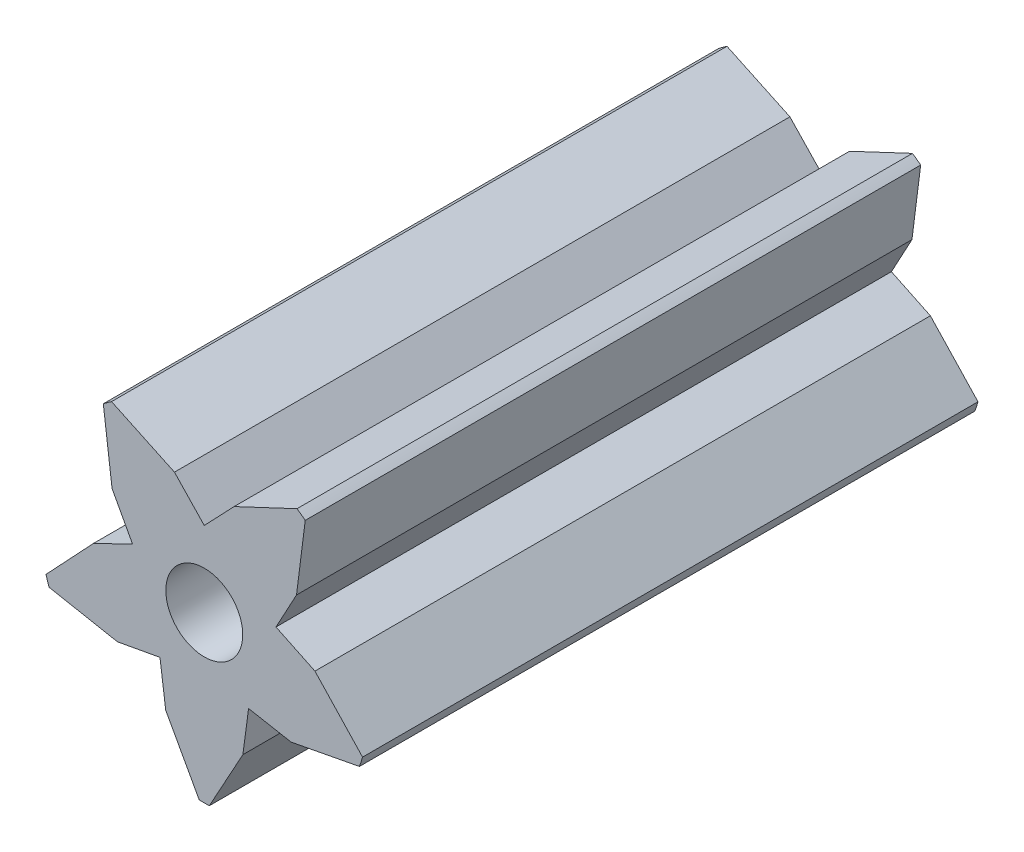
ISO-10303-21;
HEADER;
FILE_DESCRIPTION(('STEP AP214'),'2;1');
FILE_NAME('part.step','',(''),(''),'','','');
FILE_SCHEMA(('AUTOMOTIVE_DESIGN { 1 0 10303 214 1 1 1 1 }'));
ENDSEC;
DATA;
#1=APPLICATION_CONTEXT('core data for automotive mechanical design processes');
#2=APPLICATION_PROTOCOL_DEFINITION('international standard','automotive_design',2000,#1);
#3=PRODUCT_CONTEXT('',#1,'mechanical');
#4=PRODUCT('Part','Part','',(#3));
#5=PRODUCT_RELATED_PRODUCT_CATEGORY('part','',(#4));
#6=PRODUCT_DEFINITION_FORMATION('','',#4);
#7=PRODUCT_DEFINITION_CONTEXT('part definition',#1,'design');
#8=PRODUCT_DEFINITION('design','',#6,#7);
#9=PRODUCT_DEFINITION_SHAPE('','',#8);
#10=(LENGTH_UNIT() NAMED_UNIT(*) SI_UNIT(.MILLI.,.METRE.));
#11=(NAMED_UNIT(*) PLANE_ANGLE_UNIT() SI_UNIT($,.RADIAN.));
#12=(NAMED_UNIT(*) SI_UNIT($,.STERADIAN.) SOLID_ANGLE_UNIT());
#13=UNCERTAINTY_MEASURE_WITH_UNIT(LENGTH_MEASURE(1.E-05),#10,'distance_accuracy_value','');
#14=(GEOMETRIC_REPRESENTATION_CONTEXT(3) GLOBAL_UNCERTAINTY_ASSIGNED_CONTEXT((#13)) GLOBAL_UNIT_ASSIGNED_CONTEXT((#10,
#11,#12)) REPRESENTATION_CONTEXT('',''));
#15=CARTESIAN_POINT('',(0.,0.,0.));
#16=DIRECTION('',(0.,0.,1.));
#17=DIRECTION('',(1.,0.,0.));
#18=AXIS2_PLACEMENT_3D('',#15,#16,#17);
#19=CARTESIAN_POINT('',(0.,0.,28.));
#20=DIRECTION('',(0.,0.,1.));
#21=DIRECTION('',(1.,0.,0.));
#22=AXIS2_PLACEMENT_3D('',#19,#20,#21);
#23=PLANE('',#22);
#24=CARTESIAN_POINT('',(0.,0.,28.));
#25=DIRECTION('',(0.,0.,1.));
#26=DIRECTION('',(1.,0.,0.));
#27=AXIS2_PLACEMENT_3D('',#24,#25,#26);
#28=CIRCLE('',#27,1.75);
#29=CARTESIAN_POINT('',(1.75,0.,28.));
#30=VERTEX_POINT('',#29);
#31=EDGE_CURVE('E373',#30,#30,#28,.T.);
#32=ORIENTED_EDGE('',*,*,#31,.F.);
#33=EDGE_LOOP('',(#32));
#34=FACE_BOUND('',#33,.T.);
#35=CARTESIAN_POINT('',(0.,0.,28.));
#36=DIRECTION('',(0.,0.,1.));
#37=DIRECTION('',(1.,0.,0.));
#38=AXIS2_PLACEMENT_3D('',#35,#36,#37);
#39=CIRCLE('',#38,7.5);
#40=CARTESIAN_POINT('',(7.05804397115943,-2.53653608316145,28.));
#41=VERTEX_POINT('',#40);
#42=CARTESIAN_POINT('',(7.20101602130368,-2.09651335815629,28.));
#43=VERTEX_POINT('',#42);
#44=EDGE_CURVE('E418',#41,#43,#39,.T.);
#45=ORIENTED_EDGE('',*,*,#44,.T.);
#46=DIRECTION('',(0.684710829113543,-0.728814846510857,0.));
#47=VECTOR('',#46,1.);
#48=CARTESIAN_POINT('',(5.03450760612941,0.209545536974573,28.));
#49=LINE('',#48,#47);
#50=CARTESIAN_POINT('',(5.03450760612941,0.209545536974573,28.));
#51=VERTEX_POINT('',#50);
#52=EDGE_CURVE('E281',#51,#43,#49,.T.);
#53=ORIENTED_EDGE('',*,*,#52,.F.);
#54=DIRECTION('',(0.901699966110062,-0.432362314635669,0.));
#55=VECTOR('',#54,1.);
#56=CARTESIAN_POINT('',(3.26146463479318,1.05971409841141,28.));
#57=LINE('',#56,#55);
#58=CARTESIAN_POINT('',(3.26146463479318,1.05971409841141,28.));
#59=VERTEX_POINT('',#58);
#60=EDGE_CURVE('E279',#59,#51,#57,.T.);
#61=ORIENTED_EDGE('',*,*,#60,.F.);
#62=DIRECTION('',(-0.47535440422045,-0.879794402339672,0.));
#63=VECTOR('',#62,1.);
#64=CARTESIAN_POINT('',(3.26146463479318,1.05971409841141,28.));
#65=LINE('',#64,#63);
#66=CARTESIAN_POINT('',(4.19616998798593,2.78968342292939,28.));
#67=VERTEX_POINT('',#66);
#68=EDGE_CURVE('E286',#67,#59,#65,.T.);
#69=ORIENTED_EDGE('',*,*,#68,.F.);
#70=DIRECTION('',(-0.12555607855451,-0.992086524017948,0.));
#71=VECTOR('',#70,1.);
#72=CARTESIAN_POINT('',(4.19616998798593,2.78968342292939,28.));
#73=LINE('',#72,#71);
#74=CARTESIAN_POINT('',(4.59344470484238,5.92876595452676,28.));
#75=VERTEX_POINT('',#74);
#76=EDGE_CURVE('E284',#75,#67,#73,.T.);
#77=ORIENTED_EDGE('',*,*,#76,.F.);
#78=CARTESIAN_POINT('',(4.21913901812355,6.20071495440223,28.));
#79=VERTEX_POINT('',#78);
#80=EDGE_CURVE('E43',#75,#79,#39,.T.);
#81=ORIENTED_EDGE('',*,*,#80,.T.);
#82=DIRECTION('',(0.904731391375453,0.425982522481658,0.));
#83=VECTOR('',#82,1.);
#84=CARTESIAN_POINT('',(1.35645876020374,4.85285439716745,28.));
#85=LINE('',#84,#83);
#86=CARTESIAN_POINT('',(1.35645876020374,4.85285439716745,28.));
#87=VERTEX_POINT('',#86);
#88=EDGE_CURVE('E341',#87,#79,#85,.T.);
#89=ORIENTED_EDGE('',*,*,#88,.F.);
#90=DIRECTION('',(0.68984161009004,0.723960325562376,0.));
#91=VECTOR('',#90,1.);
#92=CARTESIAN_POINT('',(0.,3.4293068591741,28.));
#93=LINE('',#92,#91);
#94=CARTESIAN_POINT('',(0.,3.4293068591741,28.));
#95=VERTEX_POINT('',#94);
#96=EDGE_CURVE('E339',#95,#87,#93,.T.);
#97=ORIENTED_EDGE('',*,*,#96,.F.);
#98=DIRECTION('',(0.68984161009004,-0.723960325562376,0.));
#99=VECTOR('',#98,1.);
#100=CARTESIAN_POINT('',(0.,3.4293068591741,28.));
#101=LINE('',#100,#99);
#102=CARTESIAN_POINT('',(-1.35645876020374,4.85285439716745,28.));
#103=VERTEX_POINT('',#102);
#104=EDGE_CURVE('E347',#103,#95,#101,.T.);
#105=ORIENTED_EDGE('',*,*,#104,.F.);
#106=DIRECTION('',(0.904731391375453,-0.425982522481658,0.));
#107=VECTOR('',#106,1.);
#108=CARTESIAN_POINT('',(-1.35645876020374,4.85285439716745,28.));
#109=LINE('',#108,#107);
#110=CARTESIAN_POINT('',(-4.21913901812355,6.20071495440223,28.));
#111=VERTEX_POINT('',#110);
#112=EDGE_CURVE('E345',#111,#103,#109,.T.);
#113=ORIENTED_EDGE('',*,*,#112,.F.);
#114=CARTESIAN_POINT('',(-4.59344470484246,5.92876595452669,28.));
#115=VERTEX_POINT('',#114);
#116=EDGE_CURVE('E11',#111,#115,#39,.T.);
#117=ORIENTED_EDGE('',*,*,#116,.T.);
#118=DIRECTION('',(-0.125556078554524,0.992086524017946,0.));
#119=VECTOR('',#118,1.);
#120=CARTESIAN_POINT('',(-4.19616998798597,2.78968342292934,28.));
#121=LINE('',#120,#119);
#122=CARTESIAN_POINT('',(-4.19616998798597,2.78968342292934,28.));
#123=VERTEX_POINT('',#122);
#124=EDGE_CURVE('E309',#123,#115,#121,.T.);
#125=ORIENTED_EDGE('',*,*,#124,.F.);
#126=DIRECTION('',(-0.475354404220463,0.879794402339665,0.));
#127=VECTOR('',#126,1.);
#128=CARTESIAN_POINT('',(-3.2614646347932,1.05971409841136,28.));
#129=LINE('',#128,#127);
#130=CARTESIAN_POINT('',(-3.2614646347932,1.05971409841136,28.));
#131=VERTEX_POINT('',#130);
#132=EDGE_CURVE('E307',#131,#123,#129,.T.);
#133=ORIENTED_EDGE('',*,*,#132,.F.);
#134=DIRECTION('',(0.901699966110056,0.432362314635682,0.));
#135=VECTOR('',#134,1.);
#136=CARTESIAN_POINT('',(-3.2614646347932,1.05971409841136,28.));
#137=LINE('',#136,#135);
#138=CARTESIAN_POINT('',(-5.03450760612942,0.209545536974502,28.));
#139=VERTEX_POINT('',#138);
#140=EDGE_CURVE('E314',#139,#131,#137,.T.);
#141=ORIENTED_EDGE('',*,*,#140,.F.);
#142=DIRECTION('',(0.684710829113533,0.728814846510867,0.));
#143=VECTOR('',#142,1.);
#144=CARTESIAN_POINT('',(-5.03450760612942,0.209545536974502,28.));
#145=LINE('',#144,#143);
#146=CARTESIAN_POINT('',(-7.20101602130365,-2.09651335815639,28.));
#147=VERTEX_POINT('',#146);
#148=EDGE_CURVE('E312',#147,#139,#145,.T.);
#149=ORIENTED_EDGE('',*,*,#148,.F.);
#150=CARTESIAN_POINT('',(-7.05804397115939,-2.53653608316156,28.));
#151=VERTEX_POINT('',#150);
#152=EDGE_CURVE('E42',#147,#151,#39,.T.);
#153=ORIENTED_EDGE('',*,*,#152,.T.);
#154=DIRECTION('',(-0.9823293154163,0.187160669142166,0.));
#155=VECTOR('',#154,1.);
#156=CARTESIAN_POINT('',(-3.94983443535129,-3.12873522394498,28.));
#157=LINE('',#156,#155);
#158=CARTESIAN_POINT('',(-3.94983443535129,-3.12873522394498,28.));
#159=VERTEX_POINT('',#158);
#160=EDGE_CURVE('E213',#159,#151,#157,.T.);
#161=ORIENTED_EDGE('',*,*,#160,.F.);
#162=DIRECTION('',(-0.98362678860024,-0.180217481804568,0.));
#163=VECTOR('',#162,1.);
#164=CARTESIAN_POINT('',(-2.01569599740794,-2.77436752799844,28.));
#165=LINE('',#164,#163);
#166=CARTESIAN_POINT('',(-2.01569599740794,-2.77436752799844,28.));
#167=VERTEX_POINT('',#166);
#168=EDGE_CURVE('E203',#167,#159,#165,.T.);
#169=ORIENTED_EDGE('',*,*,#168,.F.);
#170=DIRECTION('',(-0.132560383379402,0.991174931461801,0.));
#171=VECTOR('',#170,1.);
#172=CARTESIAN_POINT('',(-2.01569599740794,-2.77436752799844,28.));
#173=LINE('',#172,#171);
#174=CARTESIAN_POINT('',(-1.75503805700408,-4.72334813312636,28.));
#175=VERTEX_POINT('',#174);
#176=EDGE_CURVE('E230',#175,#167,#173,.T.);
#177=ORIENTED_EDGE('',*,*,#176,.F.);
#178=DIRECTION('',(-0.481556826518173,0.876414869130908,0.));
#179=VECTOR('',#178,1.);
#180=CARTESIAN_POINT('',(-1.75503805700408,-4.72334813312636,28.));
#181=LINE('',#180,#179);
#182=CARTESIAN_POINT('',(-0.231333636574606,-7.49643146761105,28.));
#183=VERTEX_POINT('',#182);
#184=EDGE_CURVE('E228',#183,#175,#181,.T.);
#185=ORIENTED_EDGE('',*,*,#184,.F.);
#186=CARTESIAN_POINT('',(0.231333636574714,-7.49643146761105,28.));
#187=VERTEX_POINT('',#186);
#188=EDGE_CURVE('E426',#183,#187,#39,.T.);
#189=ORIENTED_EDGE('',*,*,#188,.T.);
#190=DIRECTION('',(-0.48155682651816,-0.876414869130915,0.));
#191=VECTOR('',#190,1.);
#192=CARTESIAN_POINT('',(1.75503805700415,-4.72334813312633,28.));
#193=LINE('',#192,#191);
#194=CARTESIAN_POINT('',(1.75503805700415,-4.72334813312633,28.));
#195=VERTEX_POINT('',#194);
#196=EDGE_CURVE('E252',#195,#187,#193,.T.);
#197=ORIENTED_EDGE('',*,*,#196,.F.);
#198=DIRECTION('',(-0.132560383379387,-0.991174931461803,0.));
#199=VECTOR('',#198,1.);
#200=CARTESIAN_POINT('',(2.01569599740798,-2.77436752799841,28.));
#201=LINE('',#200,#199);
#202=CARTESIAN_POINT('',(2.01569599740798,-2.77436752799841,28.));
#203=VERTEX_POINT('',#202);
#204=EDGE_CURVE('E250',#203,#195,#201,.T.);
#205=ORIENTED_EDGE('',*,*,#204,.F.);
#206=DIRECTION('',(-0.983626788600242,0.180217481804553,0.));
#207=VECTOR('',#206,1.);
#208=CARTESIAN_POINT('',(2.01569599740798,-2.77436752799841,28.));
#209=LINE('',#208,#207);
#210=CARTESIAN_POINT('',(3.94983443535133,-3.12873522394493,28.));
#211=VERTEX_POINT('',#210);
#212=EDGE_CURVE('E257',#211,#203,#209,.T.);
#213=ORIENTED_EDGE('',*,*,#212,.F.);
#214=DIRECTION('',(-0.982329315416297,-0.18716066914218,0.));
#215=VECTOR('',#214,1.);
#216=CARTESIAN_POINT('',(3.94983443535133,-3.12873522394493,28.));
#217=LINE('',#216,#215);
#218=EDGE_CURVE('E255',#41,#211,#217,.T.);
#219=ORIENTED_EDGE('',*,*,#218,.F.);
#220=EDGE_LOOP('',(#45,#53,#61,#69,#77,#81,#89,#97,#105,#113,#117,#125,#133,#141,#149,#153,#161,
#169,#177,#185,#189,#197,#205,#213,#219));
#221=FACE_BOUND('',#220,.T.);
#222=ADVANCED_FACE('F33',(#34,#221),#23,.T.);
#223=CARTESIAN_POINT('',(0.,0.,0.));
#224=DIRECTION('',(0.,0.,1.));
#225=DIRECTION('',(1.,0.,0.));
#226=AXIS2_PLACEMENT_3D('',#223,#224,#225);
#227=PLANE('',#226);
#228=CARTESIAN_POINT('',(0.,0.,0.));
#229=DIRECTION('',(0.,0.,1.));
#230=DIRECTION('',(1.,0.,0.));
#231=AXIS2_PLACEMENT_3D('',#228,#229,#230);
#232=CIRCLE('',#231,1.75);
#233=CARTESIAN_POINT('',(1.75,0.,0.));
#234=VERTEX_POINT('',#233);
#235=EDGE_CURVE('E372',#234,#234,#232,.T.);
#236=ORIENTED_EDGE('',*,*,#235,.T.);
#237=EDGE_LOOP('',(#236));
#238=FACE_BOUND('',#237,.T.);
#239=DIRECTION('',(0.684710829113543,-0.728814846510857,0.));
#240=VECTOR('',#239,1.);
#241=CARTESIAN_POINT('',(5.03450760612941,0.209545536974573,0.));
#242=LINE('',#241,#240);
#243=CARTESIAN_POINT('',(5.03450760612941,0.209545536974573,0.));
#244=VERTEX_POINT('',#243);
#245=CARTESIAN_POINT('',(7.20101602130368,-2.09651335815629,0.));
#246=VERTEX_POINT('',#245);
#247=EDGE_CURVE('E292',#244,#246,#242,.T.);
#248=ORIENTED_EDGE('',*,*,#247,.T.);
#249=CARTESIAN_POINT('',(0.,0.,0.));
#250=DIRECTION('',(0.,0.,1.));
#251=DIRECTION('',(1.,0.,0.));
#252=AXIS2_PLACEMENT_3D('',#249,#250,#251);
#253=CIRCLE('',#252,7.5);
#254=CARTESIAN_POINT('',(7.05804397115943,-2.53653608316146,0.));
#255=VERTEX_POINT('',#254);
#256=EDGE_CURVE('E420',#255,#246,#253,.T.);
#257=ORIENTED_EDGE('',*,*,#256,.F.);
#258=DIRECTION('',(-0.982329315416297,-0.18716066914218,0.));
#259=VECTOR('',#258,1.);
#260=CARTESIAN_POINT('',(3.94983443535133,-3.12873522394493,0.));
#261=LINE('',#260,#259);
#262=CARTESIAN_POINT('',(3.94983443535133,-3.12873522394493,0.));
#263=VERTEX_POINT('',#262);
#264=EDGE_CURVE('E58',#255,#263,#261,.T.);
#265=ORIENTED_EDGE('',*,*,#264,.T.);
#266=DIRECTION('',(-0.983626788600242,0.180217481804553,0.));
#267=VECTOR('',#266,1.);
#268=CARTESIAN_POINT('',(2.01569599740798,-2.77436752799841,0.));
#269=LINE('',#268,#267);
#270=CARTESIAN_POINT('',(2.01569599740798,-2.77436752799841,0.));
#271=VERTEX_POINT('',#270);
#272=EDGE_CURVE('E253',#263,#271,#269,.T.);
#273=ORIENTED_EDGE('',*,*,#272,.T.);
#274=DIRECTION('',(-0.132560383379387,-0.991174931461803,0.));
#275=VECTOR('',#274,1.);
#276=CARTESIAN_POINT('',(2.01569599740798,-2.77436752799841,0.));
#277=LINE('',#276,#275);
#278=CARTESIAN_POINT('',(1.75503805700415,-4.72334813312633,0.));
#279=VERTEX_POINT('',#278);
#280=EDGE_CURVE('E260',#271,#279,#277,.T.);
#281=ORIENTED_EDGE('',*,*,#280,.T.);
#282=DIRECTION('',(-0.48155682651816,-0.876414869130915,0.));
#283=VECTOR('',#282,1.);
#284=CARTESIAN_POINT('',(1.75503805700415,-4.72334813312633,0.));
#285=LINE('',#284,#283);
#286=CARTESIAN_POINT('',(0.231333636574714,-7.49643146761105,0.));
#287=VERTEX_POINT('',#286);
#288=EDGE_CURVE('E263',#279,#287,#285,.T.);
#289=ORIENTED_EDGE('',*,*,#288,.T.);
#290=CARTESIAN_POINT('',(-0.2313336365746,-7.49643146761105,0.));
#291=VERTEX_POINT('',#290);
#292=EDGE_CURVE('E436',#291,#287,#253,.T.);
#293=ORIENTED_EDGE('',*,*,#292,.F.);
#294=DIRECTION('',(-0.481556826518173,0.876414869130908,0.));
#295=VECTOR('',#294,1.);
#296=CARTESIAN_POINT('',(-1.75503805700408,-4.72334813312636,0.));
#297=LINE('',#296,#295);
#298=CARTESIAN_POINT('',(-1.75503805700408,-4.72334813312636,0.));
#299=VERTEX_POINT('',#298);
#300=EDGE_CURVE('E238',#291,#299,#297,.T.);
#301=ORIENTED_EDGE('',*,*,#300,.T.);
#302=DIRECTION('',(-0.132560383379402,0.991174931461801,0.));
#303=VECTOR('',#302,1.);
#304=CARTESIAN_POINT('',(-2.01569599740794,-2.77436752799844,0.));
#305=LINE('',#304,#303);
#306=CARTESIAN_POINT('',(-2.01569599740794,-2.77436752799844,0.));
#307=VERTEX_POINT('',#306);
#308=EDGE_CURVE('E214',#299,#307,#305,.T.);
#309=ORIENTED_EDGE('',*,*,#308,.T.);
#310=DIRECTION('',(-0.98362678860024,-0.180217481804568,0.));
#311=VECTOR('',#310,1.);
#312=CARTESIAN_POINT('',(-2.01569599740794,-2.77436752799844,0.));
#313=LINE('',#312,#311);
#314=CARTESIAN_POINT('',(-3.94983443535129,-3.12873522394498,0.));
#315=VERTEX_POINT('',#314);
#316=EDGE_CURVE('E234',#307,#315,#313,.T.);
#317=ORIENTED_EDGE('',*,*,#316,.T.);
#318=DIRECTION('',(-0.9823293154163,0.187160669142166,0.));
#319=VECTOR('',#318,1.);
#320=CARTESIAN_POINT('',(-3.94983443535129,-3.12873522394498,0.));
#321=LINE('',#320,#319);
#322=CARTESIAN_POINT('',(-7.05804397115939,-2.53653608316156,0.));
#323=VERTEX_POINT('',#322);
#324=EDGE_CURVE('E220',#315,#323,#321,.T.);
#325=ORIENTED_EDGE('',*,*,#324,.T.);
#326=CARTESIAN_POINT('',(-7.20101602130364,-2.0965133581564,0.));
#327=VERTEX_POINT('',#326);
#328=EDGE_CURVE('E432',#327,#323,#253,.T.);
#329=ORIENTED_EDGE('',*,*,#328,.F.);
#330=DIRECTION('',(0.684710829113533,0.728814846510867,0.));
#331=VECTOR('',#330,1.);
#332=CARTESIAN_POINT('',(-5.03450760612942,0.209545536974502,0.));
#333=LINE('',#332,#331);
#334=CARTESIAN_POINT('',(-5.03450760612942,0.209545536974502,0.));
#335=VERTEX_POINT('',#334);
#336=EDGE_CURVE('E322',#327,#335,#333,.T.);
#337=ORIENTED_EDGE('',*,*,#336,.T.);
#338=DIRECTION('',(0.901699966110056,0.432362314635682,0.));
#339=VECTOR('',#338,1.);
#340=CARTESIAN_POINT('',(-3.2614646347932,1.05971409841136,0.));
#341=LINE('',#340,#339);
#342=CARTESIAN_POINT('',(-3.2614646347932,1.05971409841136,0.));
#343=VERTEX_POINT('',#342);
#344=EDGE_CURVE('E310',#335,#343,#341,.T.);
#345=ORIENTED_EDGE('',*,*,#344,.T.);
#346=DIRECTION('',(-0.475354404220463,0.879794402339665,0.));
#347=VECTOR('',#346,1.);
#348=CARTESIAN_POINT('',(-3.2614646347932,1.05971409841136,0.));
#349=LINE('',#348,#347);
#350=CARTESIAN_POINT('',(-4.19616998798597,2.78968342292934,0.));
#351=VERTEX_POINT('',#350);
#352=EDGE_CURVE('E221',#343,#351,#349,.T.);
#353=ORIENTED_EDGE('',*,*,#352,.T.);
#354=DIRECTION('',(-0.125556078554524,0.992086524017946,0.));
#355=VECTOR('',#354,1.);
#356=CARTESIAN_POINT('',(-4.19616998798597,2.78968342292934,0.));
#357=LINE('',#356,#355);
#358=CARTESIAN_POINT('',(-4.59344470484246,5.92876595452669,0.));
#359=VERTEX_POINT('',#358);
#360=EDGE_CURVE('E319',#351,#359,#357,.T.);
#361=ORIENTED_EDGE('',*,*,#360,.T.);
#362=CARTESIAN_POINT('',(-4.21913901812355,6.20071495440223,0.));
#363=VERTEX_POINT('',#362);
#364=EDGE_CURVE('E37',#363,#359,#253,.T.);
#365=ORIENTED_EDGE('',*,*,#364,.F.);
#366=DIRECTION('',(0.904731391375453,-0.425982522481658,0.));
#367=VECTOR('',#366,1.);
#368=CARTESIAN_POINT('',(-1.35645876020374,4.85285439716745,0.));
#369=LINE('',#368,#367);
#370=CARTESIAN_POINT('',(-1.35645876020374,4.85285439716745,0.));
#371=VERTEX_POINT('',#370);
#372=EDGE_CURVE('E355',#363,#371,#369,.T.);
#373=ORIENTED_EDGE('',*,*,#372,.T.);
#374=DIRECTION('',(0.68984161009004,-0.723960325562376,0.));
#375=VECTOR('',#374,1.);
#376=CARTESIAN_POINT('',(0.,3.4293068591741,0.));
#377=LINE('',#376,#375);
#378=CARTESIAN_POINT('',(0.,3.4293068591741,0.));
#379=VERTEX_POINT('',#378);
#380=EDGE_CURVE('E342',#371,#379,#377,.T.);
#381=ORIENTED_EDGE('',*,*,#380,.T.);
#382=DIRECTION('',(0.68984161009004,0.723960325562376,0.));
#383=VECTOR('',#382,1.);
#384=CARTESIAN_POINT('',(0.,3.4293068591741,0.));
#385=LINE('',#384,#383);
#386=CARTESIAN_POINT('',(1.35645876020374,4.85285439716745,0.));
#387=VERTEX_POINT('',#386);
#388=EDGE_CURVE('E338',#379,#387,#385,.T.);
#389=ORIENTED_EDGE('',*,*,#388,.T.);
#390=DIRECTION('',(0.904731391375453,0.425982522481658,0.));
#391=VECTOR('',#390,1.);
#392=CARTESIAN_POINT('',(1.35645876020374,4.85285439716745,0.));
#393=LINE('',#392,#391);
#394=CARTESIAN_POINT('',(4.21913901812355,6.20071495440223,0.));
#395=VERTEX_POINT('',#394);
#396=EDGE_CURVE('E352',#387,#395,#393,.T.);
#397=ORIENTED_EDGE('',*,*,#396,.T.);
#398=CARTESIAN_POINT('',(4.59344470484237,5.92876595452676,0.));
#399=VERTEX_POINT('',#398);
#400=EDGE_CURVE('E376',#399,#395,#253,.T.);
#401=ORIENTED_EDGE('',*,*,#400,.F.);
#402=DIRECTION('',(-0.12555607855451,-0.992086524017948,0.));
#403=VECTOR('',#402,1.);
#404=CARTESIAN_POINT('',(4.19616998798593,2.78968342292939,0.));
#405=LINE('',#404,#403);
#406=CARTESIAN_POINT('',(4.19616998798593,2.78968342292939,0.));
#407=VERTEX_POINT('',#406);
#408=EDGE_CURVE('E50',#399,#407,#405,.T.);
#409=ORIENTED_EDGE('',*,*,#408,.T.);
#410=DIRECTION('',(-0.47535440422045,-0.879794402339672,0.));
#411=VECTOR('',#410,1.);
#412=CARTESIAN_POINT('',(3.26146463479318,1.05971409841141,0.));
#413=LINE('',#412,#411);
#414=CARTESIAN_POINT('',(3.26146463479318,1.05971409841141,0.));
#415=VERTEX_POINT('',#414);
#416=EDGE_CURVE('E282',#407,#415,#413,.T.);
#417=ORIENTED_EDGE('',*,*,#416,.T.);
#418=DIRECTION('',(0.901699966110062,-0.432362314635669,0.));
#419=VECTOR('',#418,1.);
#420=CARTESIAN_POINT('',(3.26146463479318,1.05971409841141,0.));
#421=LINE('',#420,#419);
#422=EDGE_CURVE('E289',#415,#244,#421,.T.);
#423=ORIENTED_EDGE('',*,*,#422,.T.);
#424=EDGE_LOOP('',(#248,#257,#265,#273,#281,#289,#293,#301,#309,#317,#325,#329,#337,#345,#353,
#361,#365,#373,#381,#389,#397,#401,#409,#417,#423));
#425=FACE_BOUND('',#424,.T.);
#426=ADVANCED_FACE('F380',(#238,#425),#227,.F.);
#427=CARTESIAN_POINT('',(0.,0.,28.));
#428=DIRECTION('',(0.,0.,-1.));
#429=DIRECTION('',(-1.,0.,0.));
#430=AXIS2_PLACEMENT_3D('',#427,#428,#429);
#431=CYLINDRICAL_SURFACE('',#430,7.5);
#432=DIRECTION('',(0.,0.,-1.));
#433=VECTOR('',#432,1.);
#434=CARTESIAN_POINT('',(7.20101602130368,-2.09651335815629,28.));
#435=LINE('',#434,#433);
#436=EDGE_CURVE('E303',#43,#246,#435,.T.);
#437=ORIENTED_EDGE('',*,*,#436,.F.);
#438=ORIENTED_EDGE('',*,*,#44,.F.);
#439=DIRECTION('',(0.,0.,-1.));
#440=VECTOR('',#439,1.);
#441=CARTESIAN_POINT('',(7.05804397115943,-2.53653608316145,28.));
#442=LINE('',#441,#440);
#443=EDGE_CURVE('E273',#41,#255,#442,.T.);
#444=ORIENTED_EDGE('',*,*,#443,.T.);
#445=ORIENTED_EDGE('',*,*,#256,.T.);
#446=EDGE_LOOP('',(#437,#438,#444,#445));
#447=FACE_BOUND('',#446,.T.);
#448=ADVANCED_FACE('F35',(#447),#431,.T.);
#449=DIRECTION('',(0.,0.,-1.));
#450=VECTOR('',#449,1.);
#451=CARTESIAN_POINT('',(4.59344470484238,5.92876595452676,28.));
#452=LINE('',#451,#450);
#453=EDGE_CURVE('E301',#75,#399,#452,.T.);
#454=ORIENTED_EDGE('',*,*,#453,.T.);
#455=ORIENTED_EDGE('',*,*,#400,.T.);
#456=DIRECTION('',(0.,0.,-1.));
#457=VECTOR('',#456,1.);
#458=CARTESIAN_POINT('',(4.21913901812355,6.20071495440223,28.));
#459=LINE('',#458,#457);
#460=EDGE_CURVE('E366',#79,#395,#459,.T.);
#461=ORIENTED_EDGE('',*,*,#460,.F.);
#462=ORIENTED_EDGE('',*,*,#80,.F.);
#463=EDGE_LOOP('',(#454,#455,#461,#462));
#464=FACE_BOUND('',#463,.T.);
#465=ADVANCED_FACE('F408',(#464),#431,.T.);
#466=DIRECTION('',(0.,0.,-1.));
#467=VECTOR('',#466,1.);
#468=CARTESIAN_POINT('',(0.231333636574714,-7.49643146761105,28.));
#469=LINE('',#468,#467);
#470=EDGE_CURVE('E275',#187,#287,#469,.T.);
#471=ORIENTED_EDGE('',*,*,#470,.F.);
#472=ORIENTED_EDGE('',*,*,#188,.F.);
#473=DIRECTION('',(0.,0.,-1.));
#474=VECTOR('',#473,1.);
#475=CARTESIAN_POINT('',(-0.231333636574606,-7.49643146761105,28.));
#476=LINE('',#475,#474);
#477=EDGE_CURVE('E246',#183,#291,#476,.T.);
#478=ORIENTED_EDGE('',*,*,#477,.T.);
#479=ORIENTED_EDGE('',*,*,#292,.T.);
#480=EDGE_LOOP('',(#471,#472,#478,#479));
#481=FACE_BOUND('',#480,.T.);
#482=ADVANCED_FACE('F413',(#481),#431,.T.);
#483=DIRECTION('',(0.,0.,-1.));
#484=VECTOR('',#483,1.);
#485=CARTESIAN_POINT('',(-7.05804397115939,-2.53653608316156,28.));
#486=LINE('',#485,#484);
#487=EDGE_CURVE('E222',#151,#323,#486,.T.);
#488=ORIENTED_EDGE('',*,*,#487,.F.);
#489=ORIENTED_EDGE('',*,*,#152,.F.);
#490=DIRECTION('',(0.,0.,-1.));
#491=VECTOR('',#490,1.);
#492=CARTESIAN_POINT('',(-7.20101602130365,-2.09651335815639,28.));
#493=LINE('',#492,#491);
#494=EDGE_CURVE('E330',#147,#327,#493,.T.);
#495=ORIENTED_EDGE('',*,*,#494,.T.);
#496=ORIENTED_EDGE('',*,*,#328,.T.);
#497=EDGE_LOOP('',(#488,#489,#495,#496));
#498=FACE_BOUND('',#497,.T.);
#499=ADVANCED_FACE('F396',(#498),#431,.T.);
#500=DIRECTION('',(0.,0.,-1.));
#501=VECTOR('',#500,1.);
#502=CARTESIAN_POINT('',(-4.59344470484246,5.92876595452669,28.));
#503=LINE('',#502,#501);
#504=EDGE_CURVE('E333',#115,#359,#503,.T.);
#505=ORIENTED_EDGE('',*,*,#504,.F.);
#506=ORIENTED_EDGE('',*,*,#116,.F.);
#507=DIRECTION('',(0.,0.,-1.));
#508=VECTOR('',#507,1.);
#509=CARTESIAN_POINT('',(-4.21913901812355,6.20071495440223,28.));
#510=LINE('',#509,#508);
#511=EDGE_CURVE('E363',#111,#363,#510,.T.);
#512=ORIENTED_EDGE('',*,*,#511,.T.);
#513=ORIENTED_EDGE('',*,*,#364,.T.);
#514=EDGE_LOOP('',(#505,#506,#512,#513));
#515=FACE_BOUND('',#514,.T.);
#516=ADVANCED_FACE('F386',(#515),#431,.T.);
#517=CARTESIAN_POINT('',(0.,0.,28.));
#518=DIRECTION('',(0.,0.,-1.));
#519=DIRECTION('',(-1.,0.,0.));
#520=AXIS2_PLACEMENT_3D('',#517,#518,#519);
#521=CYLINDRICAL_SURFACE('',#520,1.75);
#522=ORIENTED_EDGE('',*,*,#31,.T.);
#523=EDGE_LOOP('',(#522));
#524=FACE_BOUND('',#523,.T.);
#525=ORIENTED_EDGE('',*,*,#235,.F.);
#526=EDGE_LOOP('',(#525));
#527=FACE_BOUND('',#526,.T.);
#528=ADVANCED_FACE('F383',(#524,#527),#521,.F.);
#529=CARTESIAN_POINT('',(0.,3.4293068591741,28.));
#530=DIRECTION('',(-0.723960325562376,0.68984161009004,0.));
#531=DIRECTION('',(-0.68984161009004,-0.723960325562376,0.));
#532=AXIS2_PLACEMENT_3D('',#529,#530,#531);
#533=PLANE('',#532);
#534=ORIENTED_EDGE('',*,*,#388,.F.);
#535=DIRECTION('',(0.,0.,-1.));
#536=VECTOR('',#535,1.);
#537=CARTESIAN_POINT('',(0.,3.4293068591741,28.));
#538=LINE('',#537,#536);
#539=EDGE_CURVE('E349',#95,#379,#538,.T.);
#540=ORIENTED_EDGE('',*,*,#539,.F.);
#541=ORIENTED_EDGE('',*,*,#96,.T.);
#542=DIRECTION('',(0.,0.,-1.));
#543=VECTOR('',#542,1.);
#544=CARTESIAN_POINT('',(1.35645876020374,4.85285439716745,28.));
#545=LINE('',#544,#543);
#546=EDGE_CURVE('E369',#87,#387,#545,.T.);
#547=ORIENTED_EDGE('',*,*,#546,.T.);
#548=EDGE_LOOP('',(#534,#540,#541,#547));
#549=FACE_BOUND('',#548,.T.);
#550=ADVANCED_FACE('F385',(#549),#533,.T.);
#551=CARTESIAN_POINT('',(1.35645876020374,4.85285439716745,28.));
#552=DIRECTION('',(-0.425982522481658,0.904731391375453,0.));
#553=DIRECTION('',(-0.904731391375453,-0.425982522481659,0.));
#554=AXIS2_PLACEMENT_3D('',#551,#552,#553);
#555=PLANE('',#554);
#556=ORIENTED_EDGE('',*,*,#396,.F.);
#557=ORIENTED_EDGE('',*,*,#546,.F.);
#558=ORIENTED_EDGE('',*,*,#88,.T.);
#559=ORIENTED_EDGE('',*,*,#460,.T.);
#560=EDGE_LOOP('',(#556,#557,#558,#559));
#561=FACE_BOUND('',#560,.T.);
#562=ADVANCED_FACE('F393',(#561),#555,.T.);
#563=CARTESIAN_POINT('',(-1.35645876020374,4.85285439716745,28.));
#564=DIRECTION('',(0.425982522481658,0.904731391375453,0.));
#565=DIRECTION('',(-0.904731391375453,0.425982522481659,0.));
#566=AXIS2_PLACEMENT_3D('',#563,#564,#565);
#567=PLANE('',#566);
#568=ORIENTED_EDGE('',*,*,#372,.F.);
#569=ORIENTED_EDGE('',*,*,#511,.F.);
#570=ORIENTED_EDGE('',*,*,#112,.T.);
#571=DIRECTION('',(0.,0.,-1.));
#572=VECTOR('',#571,1.);
#573=CARTESIAN_POINT('',(-1.35645876020374,4.85285439716745,28.));
#574=LINE('',#573,#572);
#575=EDGE_CURVE('E361',#103,#371,#574,.T.);
#576=ORIENTED_EDGE('',*,*,#575,.T.);
#577=EDGE_LOOP('',(#568,#569,#570,#576));
#578=FACE_BOUND('',#577,.T.);
#579=ADVANCED_FACE('F484',(#578),#567,.T.);
#580=CARTESIAN_POINT('',(0.,3.4293068591741,28.));
#581=DIRECTION('',(0.723960325562376,0.68984161009004,0.));
#582=DIRECTION('',(-0.68984161009004,0.723960325562376,0.));
#583=AXIS2_PLACEMENT_3D('',#580,#581,#582);
#584=PLANE('',#583);
#585=ORIENTED_EDGE('',*,*,#380,.F.);
#586=ORIENTED_EDGE('',*,*,#575,.F.);
#587=ORIENTED_EDGE('',*,*,#104,.T.);
#588=ORIENTED_EDGE('',*,*,#539,.T.);
#589=EDGE_LOOP('',(#585,#586,#587,#588));
#590=FACE_BOUND('',#589,.T.);
#591=ADVANCED_FACE('F487',(#590),#584,.T.);
#592=CARTESIAN_POINT('',(-3.2614646347932,1.05971409841136,28.));
#593=DIRECTION('',(-0.879794402339665,-0.475354404220463,0.));
#594=DIRECTION('',(0.475354404220463,-0.879794402339665,0.));
#595=AXIS2_PLACEMENT_3D('',#592,#593,#594);
#596=PLANE('',#595);
#597=ORIENTED_EDGE('',*,*,#352,.F.);
#598=DIRECTION('',(0.,0.,-1.));
#599=VECTOR('',#598,1.);
#600=CARTESIAN_POINT('',(-3.2614646347932,1.05971409841136,28.));
#601=LINE('',#600,#599);
#602=EDGE_CURVE('E316',#131,#343,#601,.T.);
#603=ORIENTED_EDGE('',*,*,#602,.F.);
#604=ORIENTED_EDGE('',*,*,#132,.T.);
#605=DIRECTION('',(0.,0.,-1.));
#606=VECTOR('',#605,1.);
#607=CARTESIAN_POINT('',(-4.19616998798597,2.78968342292934,28.));
#608=LINE('',#607,#606);
#609=EDGE_CURVE('E335',#123,#351,#608,.T.);
#610=ORIENTED_EDGE('',*,*,#609,.T.);
#611=EDGE_LOOP('',(#597,#603,#604,#610));
#612=FACE_BOUND('',#611,.T.);
#613=ADVANCED_FACE('F474',(#612),#596,.T.);
#614=CARTESIAN_POINT('',(-4.19616998798597,2.78968342292934,28.));
#615=DIRECTION('',(-0.992086524017946,-0.125556078554524,0.));
#616=DIRECTION('',(0.125556078554524,-0.992086524017946,0.));
#617=AXIS2_PLACEMENT_3D('',#614,#615,#616);
#618=PLANE('',#617);
#619=ORIENTED_EDGE('',*,*,#360,.F.);
#620=ORIENTED_EDGE('',*,*,#609,.F.);
#621=ORIENTED_EDGE('',*,*,#124,.T.);
#622=ORIENTED_EDGE('',*,*,#504,.T.);
#623=EDGE_LOOP('',(#619,#620,#621,#622));
#624=FACE_BOUND('',#623,.T.);
#625=ADVANCED_FACE('F477',(#624),#618,.T.);
#626=CARTESIAN_POINT('',(-5.03450760612942,0.209545536974502,28.));
#627=DIRECTION('',(-0.728814846510867,0.684710829113533,0.));
#628=DIRECTION('',(-0.684710829113533,-0.728814846510867,0.));
#629=AXIS2_PLACEMENT_3D('',#626,#627,#628);
#630=PLANE('',#629);
#631=ORIENTED_EDGE('',*,*,#336,.F.);
#632=ORIENTED_EDGE('',*,*,#494,.F.);
#633=ORIENTED_EDGE('',*,*,#148,.T.);
#634=DIRECTION('',(0.,0.,-1.));
#635=VECTOR('',#634,1.);
#636=CARTESIAN_POINT('',(-5.03450760612942,0.209545536974502,28.));
#637=LINE('',#636,#635);
#638=EDGE_CURVE('E328',#139,#335,#637,.T.);
#639=ORIENTED_EDGE('',*,*,#638,.T.);
#640=EDGE_LOOP('',(#631,#632,#633,#639));
#641=FACE_BOUND('',#640,.T.);
#642=ADVANCED_FACE('F463',(#641),#630,.T.);
#643=CARTESIAN_POINT('',(-3.2614646347932,1.05971409841136,28.));
#644=DIRECTION('',(-0.432362314635681,0.901699966110056,0.));
#645=DIRECTION('',(-0.901699966110056,-0.432362314635681,0.));
#646=AXIS2_PLACEMENT_3D('',#643,#644,#645);
#647=PLANE('',#646);
#648=ORIENTED_EDGE('',*,*,#344,.F.);
#649=ORIENTED_EDGE('',*,*,#638,.F.);
#650=ORIENTED_EDGE('',*,*,#140,.T.);
#651=ORIENTED_EDGE('',*,*,#602,.T.);
#652=EDGE_LOOP('',(#648,#649,#650,#651));
#653=FACE_BOUND('',#652,.T.);
#654=ADVANCED_FACE('F471',(#653),#647,.T.);
#655=CARTESIAN_POINT('',(-2.01569599740794,-2.77436752799844,28.));
#656=DIRECTION('',(0.180217481804568,-0.98362678860024,0.));
#657=DIRECTION('',(0.98362678860024,0.180217481804568,0.));
#658=AXIS2_PLACEMENT_3D('',#655,#656,#657);
#659=PLANE('',#658);
#660=ORIENTED_EDGE('',*,*,#316,.F.);
#661=DIRECTION('',(0.,0.,-1.));
#662=VECTOR('',#661,1.);
#663=CARTESIAN_POINT('',(-2.01569599740794,-2.77436752799844,28.));
#664=LINE('',#663,#662);
#665=EDGE_CURVE('E209',#167,#307,#664,.T.);
#666=ORIENTED_EDGE('',*,*,#665,.F.);
#667=ORIENTED_EDGE('',*,*,#168,.T.);
#668=DIRECTION('',(0.,0.,-1.));
#669=VECTOR('',#668,1.);
#670=CARTESIAN_POINT('',(-3.94983443535129,-3.12873522394498,28.));
#671=LINE('',#670,#669);
#672=EDGE_CURVE('E207',#159,#315,#671,.T.);
#673=ORIENTED_EDGE('',*,*,#672,.T.);
#674=EDGE_LOOP('',(#660,#666,#667,#673));
#675=FACE_BOUND('',#674,.T.);
#676=ADVANCED_FACE('F206',(#675),#659,.T.);
#677=CARTESIAN_POINT('',(-3.94983443535129,-3.12873522394498,28.));
#678=DIRECTION('',(-0.187160669142166,-0.9823293154163,0.));
#679=DIRECTION('',(0.9823293154163,-0.187160669142166,0.));
#680=AXIS2_PLACEMENT_3D('',#677,#678,#679);
#681=PLANE('',#680);
#682=ORIENTED_EDGE('',*,*,#324,.F.);
#683=ORIENTED_EDGE('',*,*,#672,.F.);
#684=ORIENTED_EDGE('',*,*,#160,.T.);
#685=ORIENTED_EDGE('',*,*,#487,.T.);
#686=EDGE_LOOP('',(#682,#683,#684,#685));
#687=FACE_BOUND('',#686,.T.);
#688=ADVANCED_FACE('F217',(#687),#681,.T.);
#689=CARTESIAN_POINT('',(-1.75503805700408,-4.72334813312636,28.));
#690=DIRECTION('',(-0.876414869130908,-0.481556826518173,0.));
#691=DIRECTION('',(0.481556826518173,-0.876414869130908,0.));
#692=AXIS2_PLACEMENT_3D('',#689,#690,#691);
#693=PLANE('',#692);
#694=ORIENTED_EDGE('',*,*,#300,.F.);
#695=ORIENTED_EDGE('',*,*,#477,.F.);
#696=ORIENTED_EDGE('',*,*,#184,.T.);
#697=DIRECTION('',(0.,0.,-1.));
#698=VECTOR('',#697,1.);
#699=CARTESIAN_POINT('',(-1.75503805700408,-4.72334813312636,28.));
#700=LINE('',#699,#698);
#701=EDGE_CURVE('E244',#175,#299,#700,.T.);
#702=ORIENTED_EDGE('',*,*,#701,.T.);
#703=EDGE_LOOP('',(#694,#695,#696,#702));
#704=FACE_BOUND('',#703,.T.);
#705=ADVANCED_FACE('F456',(#704),#693,.T.);
#706=CARTESIAN_POINT('',(-2.01569599740794,-2.77436752799844,28.));
#707=DIRECTION('',(-0.991174931461801,-0.132560383379402,0.));
#708=DIRECTION('',(0.132560383379402,-0.991174931461801,0.));
#709=AXIS2_PLACEMENT_3D('',#706,#707,#708);
#710=PLANE('',#709);
#711=ORIENTED_EDGE('',*,*,#308,.F.);
#712=ORIENTED_EDGE('',*,*,#701,.F.);
#713=ORIENTED_EDGE('',*,*,#176,.T.);
#714=ORIENTED_EDGE('',*,*,#665,.T.);
#715=EDGE_LOOP('',(#711,#712,#713,#714));
#716=FACE_BOUND('',#715,.T.);
#717=ADVANCED_FACE('F459',(#716),#710,.T.);
#718=CARTESIAN_POINT('',(2.01569599740798,-2.77436752799841,28.));
#719=DIRECTION('',(0.991174931461803,-0.132560383379387,0.));
#720=DIRECTION('',(0.132560383379387,0.991174931461803,0.));
#721=AXIS2_PLACEMENT_3D('',#718,#719,#720);
#722=PLANE('',#721);
#723=ORIENTED_EDGE('',*,*,#280,.F.);
#724=DIRECTION('',(0.,0.,-1.));
#725=VECTOR('',#724,1.);
#726=CARTESIAN_POINT('',(2.01569599740798,-2.77436752799841,28.));
#727=LINE('',#726,#725);
#728=EDGE_CURVE('E259',#203,#271,#727,.T.);
#729=ORIENTED_EDGE('',*,*,#728,.F.);
#730=ORIENTED_EDGE('',*,*,#204,.T.);
#731=DIRECTION('',(0.,0.,-1.));
#732=VECTOR('',#731,1.);
#733=CARTESIAN_POINT('',(1.75503805700415,-4.72334813312633,28.));
#734=LINE('',#733,#732);
#735=EDGE_CURVE('E236',#195,#279,#734,.T.);
#736=ORIENTED_EDGE('',*,*,#735,.T.);
#737=EDGE_LOOP('',(#723,#729,#730,#736));
#738=FACE_BOUND('',#737,.T.);
#739=ADVANCED_FACE('F450',(#738),#722,.T.);
#740=CARTESIAN_POINT('',(1.75503805700415,-4.72334813312633,28.));
#741=DIRECTION('',(0.876414869130915,-0.48155682651816,0.));
#742=DIRECTION('',(0.48155682651816,0.876414869130915,0.));
#743=AXIS2_PLACEMENT_3D('',#740,#741,#742);
#744=PLANE('',#743);
#745=ORIENTED_EDGE('',*,*,#288,.F.);
#746=ORIENTED_EDGE('',*,*,#735,.F.);
#747=ORIENTED_EDGE('',*,*,#196,.T.);
#748=ORIENTED_EDGE('',*,*,#470,.T.);
#749=EDGE_LOOP('',(#745,#746,#747,#748));
#750=FACE_BOUND('',#749,.T.);
#751=ADVANCED_FACE('F447',(#750),#744,.T.);
#752=CARTESIAN_POINT('',(3.94983443535133,-3.12873522394493,28.));
#753=DIRECTION('',(0.18716066914218,-0.982329315416297,0.));
#754=DIRECTION('',(0.982329315416297,0.18716066914218,0.));
#755=AXIS2_PLACEMENT_3D('',#752,#753,#754);
#756=PLANE('',#755);
#757=ORIENTED_EDGE('',*,*,#264,.F.);
#758=ORIENTED_EDGE('',*,*,#443,.F.);
#759=ORIENTED_EDGE('',*,*,#218,.T.);
#760=DIRECTION('',(0.,0.,-1.));
#761=VECTOR('',#760,1.);
#762=CARTESIAN_POINT('',(3.94983443535133,-3.12873522394493,28.));
#763=LINE('',#762,#761);
#764=EDGE_CURVE('E271',#211,#263,#763,.T.);
#765=ORIENTED_EDGE('',*,*,#764,.T.);
#766=EDGE_LOOP('',(#757,#758,#759,#765));
#767=FACE_BOUND('',#766,.T.);
#768=ADVANCED_FACE('F507',(#767),#756,.T.);
#769=CARTESIAN_POINT('',(2.01569599740798,-2.77436752799841,28.));
#770=DIRECTION('',(-0.180217481804554,-0.983626788600242,0.));
#771=DIRECTION('',(0.983626788600242,-0.180217481804554,0.));
#772=AXIS2_PLACEMENT_3D('',#769,#770,#771);
#773=PLANE('',#772);
#774=ORIENTED_EDGE('',*,*,#272,.F.);
#775=ORIENTED_EDGE('',*,*,#764,.F.);
#776=ORIENTED_EDGE('',*,*,#212,.T.);
#777=ORIENTED_EDGE('',*,*,#728,.T.);
#778=EDGE_LOOP('',(#774,#775,#776,#777));
#779=FACE_BOUND('',#778,.T.);
#780=ADVANCED_FACE('F506',(#779),#773,.T.);
#781=CARTESIAN_POINT('',(3.26146463479318,1.05971409841141,28.));
#782=DIRECTION('',(0.432362314635669,0.901699966110062,0.));
#783=DIRECTION('',(-0.901699966110062,0.432362314635669,0.));
#784=AXIS2_PLACEMENT_3D('',#781,#782,#783);
#785=PLANE('',#784);
#786=ORIENTED_EDGE('',*,*,#422,.F.);
#787=DIRECTION('',(0.,0.,-1.));
#788=VECTOR('',#787,1.);
#789=CARTESIAN_POINT('',(3.26146463479318,1.05971409841141,28.));
#790=LINE('',#789,#788);
#791=EDGE_CURVE('E288',#59,#415,#790,.T.);
#792=ORIENTED_EDGE('',*,*,#791,.F.);
#793=ORIENTED_EDGE('',*,*,#60,.T.);
#794=DIRECTION('',(0.,0.,-1.));
#795=VECTOR('',#794,1.);
#796=CARTESIAN_POINT('',(5.03450760612941,0.209545536974573,28.));
#797=LINE('',#796,#795);
#798=EDGE_CURVE('E264',#51,#244,#797,.T.);
#799=ORIENTED_EDGE('',*,*,#798,.T.);
#800=EDGE_LOOP('',(#786,#792,#793,#799));
#801=FACE_BOUND('',#800,.T.);
#802=ADVANCED_FACE('F500',(#801),#785,.T.);
#803=CARTESIAN_POINT('',(5.03450760612941,0.209545536974573,28.));
#804=DIRECTION('',(0.728814846510857,0.684710829113543,0.));
#805=DIRECTION('',(-0.684710829113543,0.728814846510857,0.));
#806=AXIS2_PLACEMENT_3D('',#803,#804,#805);
#807=PLANE('',#806);
#808=ORIENTED_EDGE('',*,*,#247,.F.);
#809=ORIENTED_EDGE('',*,*,#798,.F.);
#810=ORIENTED_EDGE('',*,*,#52,.T.);
#811=ORIENTED_EDGE('',*,*,#436,.T.);
#812=EDGE_LOOP('',(#808,#809,#810,#811));
#813=FACE_BOUND('',#812,.T.);
#814=ADVANCED_FACE('F502',(#813),#807,.T.);
#815=CARTESIAN_POINT('',(4.19616998798593,2.78968342292939,28.));
#816=DIRECTION('',(0.992086524017948,-0.12555607855451,0.));
#817=DIRECTION('',(0.12555607855451,0.992086524017948,0.));
#818=AXIS2_PLACEMENT_3D('',#815,#816,#817);
#819=PLANE('',#818);
#820=ORIENTED_EDGE('',*,*,#408,.F.);
#821=ORIENTED_EDGE('',*,*,#453,.F.);
#822=ORIENTED_EDGE('',*,*,#76,.T.);
#823=DIRECTION('',(0.,0.,-1.));
#824=VECTOR('',#823,1.);
#825=CARTESIAN_POINT('',(4.19616998798593,2.78968342292939,28.));
#826=LINE('',#825,#824);
#827=EDGE_CURVE('E299',#67,#407,#826,.T.);
#828=ORIENTED_EDGE('',*,*,#827,.T.);
#829=EDGE_LOOP('',(#820,#821,#822,#828));
#830=FACE_BOUND('',#829,.T.);
#831=ADVANCED_FACE('F522',(#830),#819,.T.);
#832=CARTESIAN_POINT('',(3.26146463479318,1.05971409841141,28.));
#833=DIRECTION('',(0.879794402339672,-0.47535440422045,0.));
#834=DIRECTION('',(0.47535440422045,0.879794402339672,0.));
#835=AXIS2_PLACEMENT_3D('',#832,#833,#834);
#836=PLANE('',#835);
#837=ORIENTED_EDGE('',*,*,#416,.F.);
#838=ORIENTED_EDGE('',*,*,#827,.F.);
#839=ORIENTED_EDGE('',*,*,#68,.T.);
#840=ORIENTED_EDGE('',*,*,#791,.T.);
#841=EDGE_LOOP('',(#837,#838,#839,#840));
#842=FACE_BOUND('',#841,.T.);
#843=ADVANCED_FACE('F496',(#842),#836,.T.);
#844=CLOSED_SHELL('',(#222,#426,#448,#465,#482,#499,#516,#528,#550,#562,#579,#591,#613,#625,
#642,#654,#676,#688,#705,#717,#739,#751,#768,#780,#802,#814,#831,#843));
#845=MANIFOLD_SOLID_BREP('B2',#844);
#846=ADVANCED_BREP_SHAPE_REPRESENTATION('',(#18,#845),#14);
#847=SHAPE_DEFINITION_REPRESENTATION(#9,#846);
ENDSEC;
END-ISO-10303-21;
